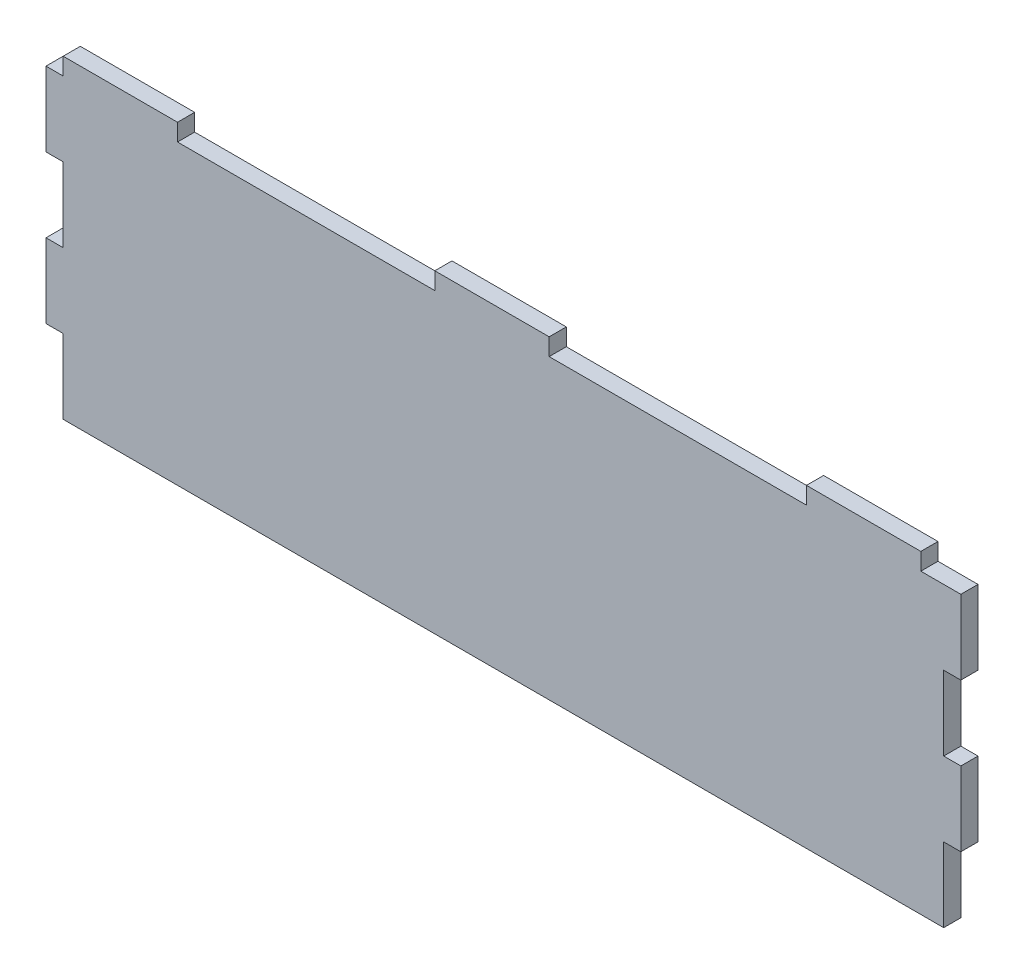
ISO-10303-21;
HEADER;
FILE_DESCRIPTION(('STEP AP214'),'2;1');
FILE_NAME('part.step','',(''),(''),'','','');
FILE_SCHEMA(('AUTOMOTIVE_DESIGN { 1 0 10303 214 1 1 1 1 }'));
ENDSEC;
DATA;
#1=APPLICATION_CONTEXT('core data for automotive mechanical design processes');
#2=APPLICATION_PROTOCOL_DEFINITION('international standard','automotive_design',2000,#1);
#3=PRODUCT_CONTEXT('',#1,'mechanical');
#4=PRODUCT('Part','Part','',(#3));
#5=PRODUCT_RELATED_PRODUCT_CATEGORY('part','',(#4));
#6=PRODUCT_DEFINITION_FORMATION('','',#4);
#7=PRODUCT_DEFINITION_CONTEXT('part definition',#1,'design');
#8=PRODUCT_DEFINITION('design','',#6,#7);
#9=PRODUCT_DEFINITION_SHAPE('','',#8);
#10=(LENGTH_UNIT() NAMED_UNIT(*) SI_UNIT(.MILLI.,.METRE.));
#11=(NAMED_UNIT(*) PLANE_ANGLE_UNIT() SI_UNIT($,.RADIAN.));
#12=(NAMED_UNIT(*) SI_UNIT($,.STERADIAN.) SOLID_ANGLE_UNIT());
#13=UNCERTAINTY_MEASURE_WITH_UNIT(LENGTH_MEASURE(1.E-05),#10,'distance_accuracy_value','');
#14=(GEOMETRIC_REPRESENTATION_CONTEXT(3) GLOBAL_UNCERTAINTY_ASSIGNED_CONTEXT((#13)) GLOBAL_UNIT_ASSIGNED_CONTEXT((#10,
#11,#12)) REPRESENTATION_CONTEXT('',''));
#15=CARTESIAN_POINT('',(0.,0.,0.));
#16=DIRECTION('',(0.,0.,1.));
#17=DIRECTION('',(1.,0.,0.));
#18=AXIS2_PLACEMENT_3D('',#15,#16,#17);
#19=CARTESIAN_POINT('',(0.,24.5,3.));
#20=DIRECTION('',(0.,1.,0.));
#21=DIRECTION('',(0.,0.,1.));
#22=AXIS2_PLACEMENT_3D('',#19,#20,#21);
#23=PLANE('',#22);
#24=DIRECTION('',(1.,0.,0.));
#25=VECTOR('',#24,1.);
#26=CARTESIAN_POINT('',(0.,24.5,0.));
#27=LINE('',#26,#25);
#28=CARTESIAN_POINT('',(-57.,24.5,0.));
#29=VERTEX_POINT('',#28);
#30=CARTESIAN_POINT('',(-12.,24.5,0.));
#31=VERTEX_POINT('',#30);
#32=EDGE_CURVE('E247',#29,#31,#27,.T.);
#33=ORIENTED_EDGE('',*,*,#32,.F.);
#34=DIRECTION('',(0.,0.,-1.));
#35=VECTOR('',#34,1.);
#36=CARTESIAN_POINT('',(-57.,24.5,3.));
#37=LINE('',#36,#35);
#38=CARTESIAN_POINT('',(-57.,24.5,3.));
#39=VERTEX_POINT('',#38);
#40=EDGE_CURVE('E11',#39,#29,#37,.T.);
#41=ORIENTED_EDGE('',*,*,#40,.F.);
#42=DIRECTION('',(1.,0.,0.));
#43=VECTOR('',#42,1.);
#44=CARTESIAN_POINT('',(0.,24.5,3.));
#45=LINE('',#44,#43);
#46=CARTESIAN_POINT('',(-12.,24.5,3.));
#47=VERTEX_POINT('',#46);
#48=EDGE_CURVE('E322',#39,#47,#45,.T.);
#49=ORIENTED_EDGE('',*,*,#48,.T.);
#50=DIRECTION('',(0.,0.,-1.));
#51=VECTOR('',#50,1.);
#52=CARTESIAN_POINT('',(-12.,24.5,3.));
#53=LINE('',#52,#51);
#54=EDGE_CURVE('E145',#47,#31,#53,.T.);
#55=ORIENTED_EDGE('',*,*,#54,.T.);
#56=EDGE_LOOP('',(#33,#41,#49,#55));
#57=FACE_BOUND('',#56,.T.);
#58=ADVANCED_FACE('F35',(#57),#23,.T.);
#59=CARTESIAN_POINT('',(-57.,0.,3.));
#60=DIRECTION('',(1.,0.,0.));
#61=DIRECTION('',(0.,0.,-1.));
#62=AXIS2_PLACEMENT_3D('',#59,#60,#61);
#63=PLANE('',#62);
#64=DIRECTION('',(0.,-1.,0.));
#65=VECTOR('',#64,1.);
#66=CARTESIAN_POINT('',(-57.,0.,0.));
#67=LINE('',#66,#65);
#68=CARTESIAN_POINT('',(-57.,27.5,0.));
#69=VERTEX_POINT('',#68);
#70=EDGE_CURVE('E250',#69,#29,#67,.T.);
#71=ORIENTED_EDGE('',*,*,#70,.F.);
#72=DIRECTION('',(0.,0.,-1.));
#73=VECTOR('',#72,1.);
#74=CARTESIAN_POINT('',(-57.,27.5,3.));
#75=LINE('',#74,#73);
#76=CARTESIAN_POINT('',(-57.,27.5,3.));
#77=VERTEX_POINT('',#76);
#78=EDGE_CURVE('E43',#77,#69,#75,.T.);
#79=ORIENTED_EDGE('',*,*,#78,.F.);
#80=DIRECTION('',(0.,-1.,0.));
#81=VECTOR('',#80,1.);
#82=CARTESIAN_POINT('',(-57.,0.,3.));
#83=LINE('',#82,#81);
#84=EDGE_CURVE('E399',#77,#39,#83,.T.);
#85=ORIENTED_EDGE('',*,*,#84,.T.);
#86=ORIENTED_EDGE('',*,*,#40,.T.);
#87=EDGE_LOOP('',(#71,#79,#85,#86));
#88=FACE_BOUND('',#87,.T.);
#89=ADVANCED_FACE('F384',(#88),#63,.T.);
#90=CARTESIAN_POINT('',(0.,27.5,3.));
#91=DIRECTION('',(0.,1.,0.));
#92=DIRECTION('',(0.,0.,1.));
#93=AXIS2_PLACEMENT_3D('',#90,#91,#92);
#94=PLANE('',#93);
#95=DIRECTION('',(1.,0.,0.));
#96=VECTOR('',#95,1.);
#97=CARTESIAN_POINT('',(0.,27.5,0.));
#98=LINE('',#97,#96);
#99=CARTESIAN_POINT('',(-77.,27.5,0.));
#100=VERTEX_POINT('',#99);
#101=EDGE_CURVE('E253',#100,#69,#98,.T.);
#102=ORIENTED_EDGE('',*,*,#101,.F.);
#103=DIRECTION('',(0.,0.,-1.));
#104=VECTOR('',#103,1.);
#105=CARTESIAN_POINT('',(-77.,27.5,3.));
#106=LINE('',#105,#104);
#107=CARTESIAN_POINT('',(-77.,27.5,3.));
#108=VERTEX_POINT('',#107);
#109=EDGE_CURVE('E373',#108,#100,#106,.T.);
#110=ORIENTED_EDGE('',*,*,#109,.F.);
#111=DIRECTION('',(1.,0.,0.));
#112=VECTOR('',#111,1.);
#113=CARTESIAN_POINT('',(0.,27.5,3.));
#114=LINE('',#113,#112);
#115=EDGE_CURVE('E380',#108,#77,#114,.T.);
#116=ORIENTED_EDGE('',*,*,#115,.T.);
#117=ORIENTED_EDGE('',*,*,#78,.T.);
#118=EDGE_LOOP('',(#102,#110,#116,#117));
#119=FACE_BOUND('',#118,.T.);
#120=ADVANCED_FACE('F378',(#119),#94,.T.);
#121=CARTESIAN_POINT('',(-77.,0.,3.));
#122=DIRECTION('',(1.,0.,0.));
#123=DIRECTION('',(0.,0.,-1.));
#124=AXIS2_PLACEMENT_3D('',#121,#122,#123);
#125=PLANE('',#124);
#126=DIRECTION('',(0.,-1.,0.));
#127=VECTOR('',#126,1.);
#128=CARTESIAN_POINT('',(-77.,0.,0.));
#129=LINE('',#128,#127);
#130=CARTESIAN_POINT('',(-77.,24.5,0.));
#131=VERTEX_POINT('',#130);
#132=EDGE_CURVE('E256',#100,#131,#129,.T.);
#133=ORIENTED_EDGE('',*,*,#132,.T.);
#134=DIRECTION('',(0.,0.,-1.));
#135=VECTOR('',#134,1.);
#136=CARTESIAN_POINT('',(-77.,24.5,3.));
#137=LINE('',#136,#135);
#138=CARTESIAN_POINT('',(-77.,24.5,3.));
#139=VERTEX_POINT('',#138);
#140=EDGE_CURVE('E371',#139,#131,#137,.T.);
#141=ORIENTED_EDGE('',*,*,#140,.F.);
#142=DIRECTION('',(0.,-1.,0.));
#143=VECTOR('',#142,1.);
#144=CARTESIAN_POINT('',(-77.,0.,3.));
#145=LINE('',#144,#143);
#146=EDGE_CURVE('E395',#108,#139,#145,.T.);
#147=ORIENTED_EDGE('',*,*,#146,.F.);
#148=ORIENTED_EDGE('',*,*,#109,.T.);
#149=EDGE_LOOP('',(#133,#141,#147,#148));
#150=FACE_BOUND('',#149,.T.);
#151=ADVANCED_FACE('F392',(#150),#125,.F.);
#152=CARTESIAN_POINT('',(0.,24.5,3.));
#153=DIRECTION('',(0.,1.,0.));
#154=DIRECTION('',(0.,0.,1.));
#155=AXIS2_PLACEMENT_3D('',#152,#153,#154);
#156=PLANE('',#155);
#157=DIRECTION('',(1.,0.,0.));
#158=VECTOR('',#157,1.);
#159=CARTESIAN_POINT('',(0.,24.5,0.));
#160=LINE('',#159,#158);
#161=CARTESIAN_POINT('',(-80.,24.5,0.));
#162=VERTEX_POINT('',#161);
#163=EDGE_CURVE('E259',#162,#131,#160,.T.);
#164=ORIENTED_EDGE('',*,*,#163,.F.);
#165=DIRECTION('',(0.,0.,-1.));
#166=VECTOR('',#165,1.);
#167=CARTESIAN_POINT('',(-80.,24.5,3.));
#168=LINE('',#167,#166);
#169=CARTESIAN_POINT('',(-80.,24.5,3.));
#170=VERTEX_POINT('',#169);
#171=EDGE_CURVE('E369',#170,#162,#168,.T.);
#172=ORIENTED_EDGE('',*,*,#171,.F.);
#173=DIRECTION('',(1.,0.,0.));
#174=VECTOR('',#173,1.);
#175=CARTESIAN_POINT('',(0.,24.5,3.));
#176=LINE('',#175,#174);
#177=EDGE_CURVE('E397',#170,#139,#176,.T.);
#178=ORIENTED_EDGE('',*,*,#177,.T.);
#179=ORIENTED_EDGE('',*,*,#140,.T.);
#180=EDGE_LOOP('',(#164,#172,#178,#179));
#181=FACE_BOUND('',#180,.T.);
#182=ADVANCED_FACE('F468',(#181),#156,.T.);
#183=CARTESIAN_POINT('',(-80.,0.,3.));
#184=DIRECTION('',(1.,0.,0.));
#185=DIRECTION('',(0.,0.,-1.));
#186=AXIS2_PLACEMENT_3D('',#183,#184,#185);
#187=PLANE('',#186);
#188=DIRECTION('',(0.,-1.,0.));
#189=VECTOR('',#188,1.);
#190=CARTESIAN_POINT('',(-80.,0.,0.));
#191=LINE('',#190,#189);
#192=CARTESIAN_POINT('',(-80.,11.5,0.));
#193=VERTEX_POINT('',#192);
#194=EDGE_CURVE('E262',#162,#193,#191,.T.);
#195=ORIENTED_EDGE('',*,*,#194,.T.);
#196=DIRECTION('',(0.,0.,-1.));
#197=VECTOR('',#196,1.);
#198=CARTESIAN_POINT('',(-80.,11.5,3.));
#199=LINE('',#198,#197);
#200=CARTESIAN_POINT('',(-80.,11.5,3.));
#201=VERTEX_POINT('',#200);
#202=EDGE_CURVE('E366',#201,#193,#199,.T.);
#203=ORIENTED_EDGE('',*,*,#202,.F.);
#204=DIRECTION('',(0.,-1.,0.));
#205=VECTOR('',#204,1.);
#206=CARTESIAN_POINT('',(-80.,0.,3.));
#207=LINE('',#206,#205);
#208=EDGE_CURVE('E405',#170,#201,#207,.T.);
#209=ORIENTED_EDGE('',*,*,#208,.F.);
#210=ORIENTED_EDGE('',*,*,#171,.T.);
#211=EDGE_LOOP('',(#195,#203,#209,#210));
#212=FACE_BOUND('',#211,.T.);
#213=ADVANCED_FACE('F471',(#212),#187,.F.);
#214=CARTESIAN_POINT('',(0.,11.5,3.));
#215=DIRECTION('',(0.,1.,0.));
#216=DIRECTION('',(0.,0.,1.));
#217=AXIS2_PLACEMENT_3D('',#214,#215,#216);
#218=PLANE('',#217);
#219=DIRECTION('',(1.,0.,0.));
#220=VECTOR('',#219,1.);
#221=CARTESIAN_POINT('',(0.,11.5,0.));
#222=LINE('',#221,#220);
#223=CARTESIAN_POINT('',(-77.,11.5,0.));
#224=VERTEX_POINT('',#223);
#225=EDGE_CURVE('E264',#193,#224,#222,.T.);
#226=ORIENTED_EDGE('',*,*,#225,.T.);
#227=DIRECTION('',(0.,0.,-1.));
#228=VECTOR('',#227,1.);
#229=CARTESIAN_POINT('',(-77.,11.5,3.));
#230=LINE('',#229,#228);
#231=CARTESIAN_POINT('',(-77.,11.5,3.));
#232=VERTEX_POINT('',#231);
#233=EDGE_CURVE('E363',#232,#224,#230,.T.);
#234=ORIENTED_EDGE('',*,*,#233,.F.);
#235=DIRECTION('',(1.,0.,0.));
#236=VECTOR('',#235,1.);
#237=CARTESIAN_POINT('',(0.,11.5,3.));
#238=LINE('',#237,#236);
#239=EDGE_CURVE('E407',#201,#232,#238,.T.);
#240=ORIENTED_EDGE('',*,*,#239,.F.);
#241=ORIENTED_EDGE('',*,*,#202,.T.);
#242=EDGE_LOOP('',(#226,#234,#240,#241));
#243=FACE_BOUND('',#242,.T.);
#244=ADVANCED_FACE('F475',(#243),#218,.F.);
#245=CARTESIAN_POINT('',(-77.,0.,3.));
#246=DIRECTION('',(1.,0.,0.));
#247=DIRECTION('',(0.,0.,-1.));
#248=AXIS2_PLACEMENT_3D('',#245,#246,#247);
#249=PLANE('',#248);
#250=DIRECTION('',(0.,-1.,0.));
#251=VECTOR('',#250,1.);
#252=CARTESIAN_POINT('',(-77.,0.,0.));
#253=LINE('',#252,#251);
#254=CARTESIAN_POINT('',(-77.,-1.5,0.));
#255=VERTEX_POINT('',#254);
#256=EDGE_CURVE('E266',#224,#255,#253,.T.);
#257=ORIENTED_EDGE('',*,*,#256,.T.);
#258=DIRECTION('',(0.,0.,-1.));
#259=VECTOR('',#258,1.);
#260=CARTESIAN_POINT('',(-77.,-1.5,3.));
#261=LINE('',#260,#259);
#262=CARTESIAN_POINT('',(-77.,-1.5,3.));
#263=VERTEX_POINT('',#262);
#264=EDGE_CURVE('E361',#263,#255,#261,.T.);
#265=ORIENTED_EDGE('',*,*,#264,.F.);
#266=DIRECTION('',(0.,-1.,0.));
#267=VECTOR('',#266,1.);
#268=CARTESIAN_POINT('',(-77.,0.,3.));
#269=LINE('',#268,#267);
#270=EDGE_CURVE('E409',#232,#263,#269,.T.);
#271=ORIENTED_EDGE('',*,*,#270,.F.);
#272=ORIENTED_EDGE('',*,*,#233,.T.);
#273=EDGE_LOOP('',(#257,#265,#271,#272));
#274=FACE_BOUND('',#273,.T.);
#275=ADVANCED_FACE('F479',(#274),#249,.F.);
#276=CARTESIAN_POINT('',(0.,-1.5,3.));
#277=DIRECTION('',(0.,1.,0.));
#278=DIRECTION('',(0.,0.,1.));
#279=AXIS2_PLACEMENT_3D('',#276,#277,#278);
#280=PLANE('',#279);
#281=DIRECTION('',(1.,0.,0.));
#282=VECTOR('',#281,1.);
#283=CARTESIAN_POINT('',(0.,-1.5,0.));
#284=LINE('',#283,#282);
#285=CARTESIAN_POINT('',(-80.,-1.5,0.));
#286=VERTEX_POINT('',#285);
#287=EDGE_CURVE('E269',#286,#255,#284,.T.);
#288=ORIENTED_EDGE('',*,*,#287,.F.);
#289=DIRECTION('',(0.,0.,-1.));
#290=VECTOR('',#289,1.);
#291=CARTESIAN_POINT('',(-80.,-1.5,3.));
#292=LINE('',#291,#290);
#293=CARTESIAN_POINT('',(-80.,-1.5,3.));
#294=VERTEX_POINT('',#293);
#295=EDGE_CURVE('E359',#294,#286,#292,.T.);
#296=ORIENTED_EDGE('',*,*,#295,.F.);
#297=DIRECTION('',(1.,0.,0.));
#298=VECTOR('',#297,1.);
#299=CARTESIAN_POINT('',(0.,-1.5,3.));
#300=LINE('',#299,#298);
#301=EDGE_CURVE('E411',#294,#263,#300,.T.);
#302=ORIENTED_EDGE('',*,*,#301,.T.);
#303=ORIENTED_EDGE('',*,*,#264,.T.);
#304=EDGE_LOOP('',(#288,#296,#302,#303));
#305=FACE_BOUND('',#304,.T.);
#306=ADVANCED_FACE('F483',(#305),#280,.T.);
#307=CARTESIAN_POINT('',(-80.,0.,3.));
#308=DIRECTION('',(1.,0.,0.));
#309=DIRECTION('',(0.,0.,-1.));
#310=AXIS2_PLACEMENT_3D('',#307,#308,#309);
#311=PLANE('',#310);
#312=DIRECTION('',(0.,-1.,0.));
#313=VECTOR('',#312,1.);
#314=CARTESIAN_POINT('',(-80.,0.,0.));
#315=LINE('',#314,#313);
#316=CARTESIAN_POINT('',(-80.,-14.5,0.));
#317=VERTEX_POINT('',#316);
#318=EDGE_CURVE('E272',#286,#317,#315,.T.);
#319=ORIENTED_EDGE('',*,*,#318,.T.);
#320=DIRECTION('',(0.,0.,-1.));
#321=VECTOR('',#320,1.);
#322=CARTESIAN_POINT('',(-80.,-14.5,3.));
#323=LINE('',#322,#321);
#324=CARTESIAN_POINT('',(-80.,-14.5,3.));
#325=VERTEX_POINT('',#324);
#326=EDGE_CURVE('E356',#325,#317,#323,.T.);
#327=ORIENTED_EDGE('',*,*,#326,.F.);
#328=DIRECTION('',(0.,-1.,0.));
#329=VECTOR('',#328,1.);
#330=CARTESIAN_POINT('',(-80.,0.,3.));
#331=LINE('',#330,#329);
#332=EDGE_CURVE('E414',#294,#325,#331,.T.);
#333=ORIENTED_EDGE('',*,*,#332,.F.);
#334=ORIENTED_EDGE('',*,*,#295,.T.);
#335=EDGE_LOOP('',(#319,#327,#333,#334));
#336=FACE_BOUND('',#335,.T.);
#337=ADVANCED_FACE('F487',(#336),#311,.F.);
#338=CARTESIAN_POINT('',(0.,-14.5,3.));
#339=DIRECTION('',(0.,1.,0.));
#340=DIRECTION('',(0.,0.,1.));
#341=AXIS2_PLACEMENT_3D('',#338,#339,#340);
#342=PLANE('',#341);
#343=DIRECTION('',(1.,0.,0.));
#344=VECTOR('',#343,1.);
#345=CARTESIAN_POINT('',(0.,-14.5,0.));
#346=LINE('',#345,#344);
#347=CARTESIAN_POINT('',(-77.,-14.5,0.));
#348=VERTEX_POINT('',#347);
#349=EDGE_CURVE('E274',#317,#348,#346,.T.);
#350=ORIENTED_EDGE('',*,*,#349,.T.);
#351=DIRECTION('',(0.,0.,-1.));
#352=VECTOR('',#351,1.);
#353=CARTESIAN_POINT('',(-77.,-14.5,3.));
#354=LINE('',#353,#352);
#355=CARTESIAN_POINT('',(-77.,-14.5,3.));
#356=VERTEX_POINT('',#355);
#357=EDGE_CURVE('E353',#356,#348,#354,.T.);
#358=ORIENTED_EDGE('',*,*,#357,.F.);
#359=DIRECTION('',(1.,0.,0.));
#360=VECTOR('',#359,1.);
#361=CARTESIAN_POINT('',(0.,-14.5,3.));
#362=LINE('',#361,#360);
#363=EDGE_CURVE('E416',#325,#356,#362,.T.);
#364=ORIENTED_EDGE('',*,*,#363,.F.);
#365=ORIENTED_EDGE('',*,*,#326,.T.);
#366=EDGE_LOOP('',(#350,#358,#364,#365));
#367=FACE_BOUND('',#366,.T.);
#368=ADVANCED_FACE('F491',(#367),#342,.F.);
#369=CARTESIAN_POINT('',(-77.,0.,3.));
#370=DIRECTION('',(1.,0.,0.));
#371=DIRECTION('',(0.,0.,-1.));
#372=AXIS2_PLACEMENT_3D('',#369,#370,#371);
#373=PLANE('',#372);
#374=DIRECTION('',(0.,-1.,0.));
#375=VECTOR('',#374,1.);
#376=CARTESIAN_POINT('',(-77.,0.,0.));
#377=LINE('',#376,#375);
#378=CARTESIAN_POINT('',(-77.,-27.5,0.));
#379=VERTEX_POINT('',#378);
#380=EDGE_CURVE('E276',#348,#379,#377,.T.);
#381=ORIENTED_EDGE('',*,*,#380,.T.);
#382=DIRECTION('',(0.,0.,-1.));
#383=VECTOR('',#382,1.);
#384=CARTESIAN_POINT('',(-77.,-27.5,3.));
#385=LINE('',#384,#383);
#386=CARTESIAN_POINT('',(-77.,-27.5,3.));
#387=VERTEX_POINT('',#386);
#388=EDGE_CURVE('E350',#387,#379,#385,.T.);
#389=ORIENTED_EDGE('',*,*,#388,.F.);
#390=DIRECTION('',(0.,-1.,0.));
#391=VECTOR('',#390,1.);
#392=CARTESIAN_POINT('',(-77.,0.,3.));
#393=LINE('',#392,#391);
#394=EDGE_CURVE('E418',#356,#387,#393,.T.);
#395=ORIENTED_EDGE('',*,*,#394,.F.);
#396=ORIENTED_EDGE('',*,*,#357,.T.);
#397=EDGE_LOOP('',(#381,#389,#395,#396));
#398=FACE_BOUND('',#397,.T.);
#399=ADVANCED_FACE('F495',(#398),#373,.F.);
#400=CARTESIAN_POINT('',(0.,-27.5,3.));
#401=DIRECTION('',(0.,1.,0.));
#402=DIRECTION('',(0.,0.,1.));
#403=AXIS2_PLACEMENT_3D('',#400,#401,#402);
#404=PLANE('',#403);
#405=DIRECTION('',(1.,0.,0.));
#406=VECTOR('',#405,1.);
#407=CARTESIAN_POINT('',(0.,-27.5,0.));
#408=LINE('',#407,#406);
#409=CARTESIAN_POINT('',(77.,-27.5,0.));
#410=VERTEX_POINT('',#409);
#411=EDGE_CURVE('E278',#379,#410,#408,.T.);
#412=ORIENTED_EDGE('',*,*,#411,.T.);
#413=DIRECTION('',(0.,0.,-1.));
#414=VECTOR('',#413,1.);
#415=CARTESIAN_POINT('',(77.,-27.5,3.));
#416=LINE('',#415,#414);
#417=CARTESIAN_POINT('',(77.,-27.5,3.));
#418=VERTEX_POINT('',#417);
#419=EDGE_CURVE('E348',#418,#410,#416,.T.);
#420=ORIENTED_EDGE('',*,*,#419,.F.);
#421=DIRECTION('',(1.,0.,0.));
#422=VECTOR('',#421,1.);
#423=CARTESIAN_POINT('',(0.,-27.5,3.));
#424=LINE('',#423,#422);
#425=EDGE_CURVE('E420',#387,#418,#424,.T.);
#426=ORIENTED_EDGE('',*,*,#425,.F.);
#427=ORIENTED_EDGE('',*,*,#388,.T.);
#428=EDGE_LOOP('',(#412,#420,#426,#427));
#429=FACE_BOUND('',#428,.T.);
#430=ADVANCED_FACE('F499',(#429),#404,.F.);
#431=CARTESIAN_POINT('',(77.,0.,3.));
#432=DIRECTION('',(1.,0.,0.));
#433=DIRECTION('',(0.,1.,0.));
#434=AXIS2_PLACEMENT_3D('',#431,#432,#433);
#435=PLANE('',#434);
#436=DIRECTION('',(0.,-1.,0.));
#437=VECTOR('',#436,1.);
#438=CARTESIAN_POINT('',(77.,0.,0.));
#439=LINE('',#438,#437);
#440=CARTESIAN_POINT('',(77.,-14.5,0.));
#441=VERTEX_POINT('',#440);
#442=EDGE_CURVE('E281',#441,#410,#439,.T.);
#443=ORIENTED_EDGE('',*,*,#442,.F.);
#444=DIRECTION('',(0.,0.,-1.));
#445=VECTOR('',#444,1.);
#446=CARTESIAN_POINT('',(77.,-14.5,3.));
#447=LINE('',#446,#445);
#448=CARTESIAN_POINT('',(77.,-14.5,3.));
#449=VERTEX_POINT('',#448);
#450=EDGE_CURVE('E346',#449,#441,#447,.T.);
#451=ORIENTED_EDGE('',*,*,#450,.F.);
#452=DIRECTION('',(0.,-1.,0.));
#453=VECTOR('',#452,1.);
#454=CARTESIAN_POINT('',(77.,0.,3.));
#455=LINE('',#454,#453);
#456=EDGE_CURVE('E422',#449,#418,#455,.T.);
#457=ORIENTED_EDGE('',*,*,#456,.T.);
#458=ORIENTED_EDGE('',*,*,#419,.T.);
#459=EDGE_LOOP('',(#443,#451,#457,#458));
#460=FACE_BOUND('',#459,.T.);
#461=ADVANCED_FACE('F503',(#460),#435,.T.);
#462=CARTESIAN_POINT('',(0.,-14.5,3.));
#463=DIRECTION('',(0.,-1.,0.));
#464=DIRECTION('',(0.,0.,-1.));
#465=AXIS2_PLACEMENT_3D('',#462,#463,#464);
#466=PLANE('',#465);
#467=DIRECTION('',(-1.,0.,0.));
#468=VECTOR('',#467,1.);
#469=CARTESIAN_POINT('',(0.,-14.5,0.));
#470=LINE('',#469,#468);
#471=CARTESIAN_POINT('',(80.,-14.5,0.));
#472=VERTEX_POINT('',#471);
#473=EDGE_CURVE('E284',#472,#441,#470,.T.);
#474=ORIENTED_EDGE('',*,*,#473,.F.);
#475=DIRECTION('',(0.,0.,-1.));
#476=VECTOR('',#475,1.);
#477=CARTESIAN_POINT('',(80.,-14.5,3.));
#478=LINE('',#477,#476);
#479=CARTESIAN_POINT('',(80.,-14.5,3.));
#480=VERTEX_POINT('',#479);
#481=EDGE_CURVE('E344',#480,#472,#478,.T.);
#482=ORIENTED_EDGE('',*,*,#481,.F.);
#483=DIRECTION('',(-1.,0.,0.));
#484=VECTOR('',#483,1.);
#485=CARTESIAN_POINT('',(0.,-14.5,3.));
#486=LINE('',#485,#484);
#487=EDGE_CURVE('E425',#480,#449,#486,.T.);
#488=ORIENTED_EDGE('',*,*,#487,.T.);
#489=ORIENTED_EDGE('',*,*,#450,.T.);
#490=EDGE_LOOP('',(#474,#482,#488,#489));
#491=FACE_BOUND('',#490,.T.);
#492=ADVANCED_FACE('F507',(#491),#466,.T.);
#493=CARTESIAN_POINT('',(80.,-1.70803542250024E-13,3.));
#494=DIRECTION('',(1.,0.,0.));
#495=DIRECTION('',(0.,1.,0.));
#496=AXIS2_PLACEMENT_3D('',#493,#494,#495);
#497=PLANE('',#496);
#498=DIRECTION('',(0.,-1.,0.));
#499=VECTOR('',#498,1.);
#500=CARTESIAN_POINT('',(80.,-1.70803542250024E-13,0.));
#501=LINE('',#500,#499);
#502=CARTESIAN_POINT('',(80.,-1.5,0.));
#503=VERTEX_POINT('',#502);
#504=EDGE_CURVE('E287',#503,#472,#501,.T.);
#505=ORIENTED_EDGE('',*,*,#504,.F.);
#506=DIRECTION('',(0.,0.,-1.));
#507=VECTOR('',#506,1.);
#508=CARTESIAN_POINT('',(80.,-1.5,3.));
#509=LINE('',#508,#507);
#510=CARTESIAN_POINT('',(80.,-1.5,3.));
#511=VERTEX_POINT('',#510);
#512=EDGE_CURVE('E342',#511,#503,#509,.T.);
#513=ORIENTED_EDGE('',*,*,#512,.F.);
#514=DIRECTION('',(0.,-1.,0.));
#515=VECTOR('',#514,1.);
#516=CARTESIAN_POINT('',(80.,-1.70803542250024E-13,3.));
#517=LINE('',#516,#515);
#518=EDGE_CURVE('E428',#511,#480,#517,.T.);
#519=ORIENTED_EDGE('',*,*,#518,.T.);
#520=ORIENTED_EDGE('',*,*,#481,.T.);
#521=EDGE_LOOP('',(#505,#513,#519,#520));
#522=FACE_BOUND('',#521,.T.);
#523=ADVANCED_FACE('F511',(#522),#497,.T.);
#524=CARTESIAN_POINT('',(0.,-1.5,3.));
#525=DIRECTION('',(0.,-1.,0.));
#526=DIRECTION('',(0.,0.,-1.));
#527=AXIS2_PLACEMENT_3D('',#524,#525,#526);
#528=PLANE('',#527);
#529=DIRECTION('',(-1.,0.,0.));
#530=VECTOR('',#529,1.);
#531=CARTESIAN_POINT('',(0.,-1.5,0.));
#532=LINE('',#531,#530);
#533=CARTESIAN_POINT('',(77.,-1.5,0.));
#534=VERTEX_POINT('',#533);
#535=EDGE_CURVE('E290',#503,#534,#532,.T.);
#536=ORIENTED_EDGE('',*,*,#535,.T.);
#537=DIRECTION('',(0.,0.,-1.));
#538=VECTOR('',#537,1.);
#539=CARTESIAN_POINT('',(77.,-1.5,3.));
#540=LINE('',#539,#538);
#541=CARTESIAN_POINT('',(77.,-1.5,3.));
#542=VERTEX_POINT('',#541);
#543=EDGE_CURVE('E340',#542,#534,#540,.T.);
#544=ORIENTED_EDGE('',*,*,#543,.F.);
#545=DIRECTION('',(-1.,0.,0.));
#546=VECTOR('',#545,1.);
#547=CARTESIAN_POINT('',(0.,-1.5,3.));
#548=LINE('',#547,#546);
#549=EDGE_CURVE('E431',#511,#542,#548,.T.);
#550=ORIENTED_EDGE('',*,*,#549,.F.);
#551=ORIENTED_EDGE('',*,*,#512,.T.);
#552=EDGE_LOOP('',(#536,#544,#550,#551));
#553=FACE_BOUND('',#552,.T.);
#554=ADVANCED_FACE('F515',(#553),#528,.F.);
#555=CARTESIAN_POINT('',(77.,1.64398409415648E-13,3.));
#556=DIRECTION('',(1.,0.,0.));
#557=DIRECTION('',(0.,1.,0.));
#558=AXIS2_PLACEMENT_3D('',#555,#556,#557);
#559=PLANE('',#558);
#560=DIRECTION('',(0.,-1.,0.));
#561=VECTOR('',#560,1.);
#562=CARTESIAN_POINT('',(77.,1.64398409415648E-13,0.));
#563=LINE('',#562,#561);
#564=CARTESIAN_POINT('',(77.,11.5,0.));
#565=VERTEX_POINT('',#564);
#566=EDGE_CURVE('E293',#565,#534,#563,.T.);
#567=ORIENTED_EDGE('',*,*,#566,.F.);
#568=DIRECTION('',(0.,0.,-1.));
#569=VECTOR('',#568,1.);
#570=CARTESIAN_POINT('',(77.,11.5,3.));
#571=LINE('',#570,#569);
#572=CARTESIAN_POINT('',(77.,11.5,3.));
#573=VERTEX_POINT('',#572);
#574=EDGE_CURVE('E338',#573,#565,#571,.T.);
#575=ORIENTED_EDGE('',*,*,#574,.F.);
#576=DIRECTION('',(0.,-1.,0.));
#577=VECTOR('',#576,1.);
#578=CARTESIAN_POINT('',(77.,1.64398409415648E-13,3.));
#579=LINE('',#578,#577);
#580=EDGE_CURVE('E433',#573,#542,#579,.T.);
#581=ORIENTED_EDGE('',*,*,#580,.T.);
#582=ORIENTED_EDGE('',*,*,#543,.T.);
#583=EDGE_LOOP('',(#567,#575,#581,#582));
#584=FACE_BOUND('',#583,.T.);
#585=ADVANCED_FACE('F519',(#584),#559,.T.);
#586=CARTESIAN_POINT('',(0.,11.5,3.));
#587=DIRECTION('',(0.,1.,0.));
#588=DIRECTION('',(0.,0.,1.));
#589=AXIS2_PLACEMENT_3D('',#586,#587,#588);
#590=PLANE('',#589);
#591=DIRECTION('',(1.,0.,0.));
#592=VECTOR('',#591,1.);
#593=CARTESIAN_POINT('',(0.,11.5,0.));
#594=LINE('',#593,#592);
#595=CARTESIAN_POINT('',(80.,11.5,0.));
#596=VERTEX_POINT('',#595);
#597=EDGE_CURVE('E296',#565,#596,#594,.T.);
#598=ORIENTED_EDGE('',*,*,#597,.T.);
#599=DIRECTION('',(0.,0.,-1.));
#600=VECTOR('',#599,1.);
#601=CARTESIAN_POINT('',(80.,11.5,3.));
#602=LINE('',#601,#600);
#603=CARTESIAN_POINT('',(80.,11.5,3.));
#604=VERTEX_POINT('',#603);
#605=EDGE_CURVE('E336',#604,#596,#602,.T.);
#606=ORIENTED_EDGE('',*,*,#605,.F.);
#607=DIRECTION('',(1.,0.,0.));
#608=VECTOR('',#607,1.);
#609=CARTESIAN_POINT('',(0.,11.5,3.));
#610=LINE('',#609,#608);
#611=EDGE_CURVE('E436',#573,#604,#610,.T.);
#612=ORIENTED_EDGE('',*,*,#611,.F.);
#613=ORIENTED_EDGE('',*,*,#574,.T.);
#614=EDGE_LOOP('',(#598,#606,#612,#613));
#615=FACE_BOUND('',#614,.T.);
#616=ADVANCED_FACE('F523',(#615),#590,.F.);
#617=CARTESIAN_POINT('',(80.,0.,3.));
#618=DIRECTION('',(1.,0.,0.));
#619=DIRECTION('',(0.,0.,-1.));
#620=AXIS2_PLACEMENT_3D('',#617,#618,#619);
#621=PLANE('',#620);
#622=DIRECTION('',(0.,-1.,0.));
#623=VECTOR('',#622,1.);
#624=CARTESIAN_POINT('',(80.,0.,0.));
#625=LINE('',#624,#623);
#626=CARTESIAN_POINT('',(80.,24.5,0.));
#627=VERTEX_POINT('',#626);
#628=EDGE_CURVE('E299',#627,#596,#625,.T.);
#629=ORIENTED_EDGE('',*,*,#628,.F.);
#630=DIRECTION('',(0.,0.,-1.));
#631=VECTOR('',#630,1.);
#632=CARTESIAN_POINT('',(80.,24.5,3.));
#633=LINE('',#632,#631);
#634=CARTESIAN_POINT('',(80.,24.5,3.));
#635=VERTEX_POINT('',#634);
#636=EDGE_CURVE('E334',#635,#627,#633,.T.);
#637=ORIENTED_EDGE('',*,*,#636,.F.);
#638=DIRECTION('',(0.,-1.,0.));
#639=VECTOR('',#638,1.);
#640=CARTESIAN_POINT('',(80.,0.,3.));
#641=LINE('',#640,#639);
#642=EDGE_CURVE('E438',#635,#604,#641,.T.);
#643=ORIENTED_EDGE('',*,*,#642,.T.);
#644=ORIENTED_EDGE('',*,*,#605,.T.);
#645=EDGE_LOOP('',(#629,#637,#643,#644));
#646=FACE_BOUND('',#645,.T.);
#647=ADVANCED_FACE('F527',(#646),#621,.T.);
#648=CARTESIAN_POINT('',(0.,24.5,3.));
#649=DIRECTION('',(0.,1.,0.));
#650=DIRECTION('',(0.,0.,1.));
#651=AXIS2_PLACEMENT_3D('',#648,#649,#650);
#652=PLANE('',#651);
#653=DIRECTION('',(1.,0.,0.));
#654=VECTOR('',#653,1.);
#655=CARTESIAN_POINT('',(0.,24.5,0.));
#656=LINE('',#655,#654);
#657=CARTESIAN_POINT('',(73.,24.5,0.));
#658=VERTEX_POINT('',#657);
#659=EDGE_CURVE('E302',#658,#627,#656,.T.);
#660=ORIENTED_EDGE('',*,*,#659,.F.);
#661=DIRECTION('',(0.,0.,-1.));
#662=VECTOR('',#661,1.);
#663=CARTESIAN_POINT('',(73.,24.5,3.));
#664=LINE('',#663,#662);
#665=CARTESIAN_POINT('',(73.,24.5,3.));
#666=VERTEX_POINT('',#665);
#667=EDGE_CURVE('E332',#666,#658,#664,.T.);
#668=ORIENTED_EDGE('',*,*,#667,.F.);
#669=DIRECTION('',(1.,0.,0.));
#670=VECTOR('',#669,1.);
#671=CARTESIAN_POINT('',(0.,24.5,3.));
#672=LINE('',#671,#670);
#673=EDGE_CURVE('E441',#666,#635,#672,.T.);
#674=ORIENTED_EDGE('',*,*,#673,.T.);
#675=ORIENTED_EDGE('',*,*,#636,.T.);
#676=EDGE_LOOP('',(#660,#668,#674,#675));
#677=FACE_BOUND('',#676,.T.);
#678=ADVANCED_FACE('F531',(#677),#652,.T.);
#679=CARTESIAN_POINT('',(73.,0.,3.));
#680=DIRECTION('',(1.,0.,0.));
#681=DIRECTION('',(0.,0.,-1.));
#682=AXIS2_PLACEMENT_3D('',#679,#680,#681);
#683=PLANE('',#682);
#684=DIRECTION('',(0.,-1.,0.));
#685=VECTOR('',#684,1.);
#686=CARTESIAN_POINT('',(73.,0.,0.));
#687=LINE('',#686,#685);
#688=CARTESIAN_POINT('',(73.,27.5,0.));
#689=VERTEX_POINT('',#688);
#690=EDGE_CURVE('E305',#689,#658,#687,.T.);
#691=ORIENTED_EDGE('',*,*,#690,.F.);
#692=DIRECTION('',(0.,0.,-1.));
#693=VECTOR('',#692,1.);
#694=CARTESIAN_POINT('',(73.,27.5,3.));
#695=LINE('',#694,#693);
#696=CARTESIAN_POINT('',(73.,27.5,3.));
#697=VERTEX_POINT('',#696);
#698=EDGE_CURVE('E330',#697,#689,#695,.T.);
#699=ORIENTED_EDGE('',*,*,#698,.F.);
#700=DIRECTION('',(0.,-1.,0.));
#701=VECTOR('',#700,1.);
#702=CARTESIAN_POINT('',(73.,0.,3.));
#703=LINE('',#702,#701);
#704=EDGE_CURVE('E444',#697,#666,#703,.T.);
#705=ORIENTED_EDGE('',*,*,#704,.T.);
#706=ORIENTED_EDGE('',*,*,#667,.T.);
#707=EDGE_LOOP('',(#691,#699,#705,#706));
#708=FACE_BOUND('',#707,.T.);
#709=ADVANCED_FACE('F535',(#708),#683,.T.);
#710=CARTESIAN_POINT('',(0.,27.5,3.));
#711=DIRECTION('',(0.,1.,0.));
#712=DIRECTION('',(-1.,0.,0.));
#713=AXIS2_PLACEMENT_3D('',#710,#711,#712);
#714=PLANE('',#713);
#715=DIRECTION('',(1.,0.,0.));
#716=VECTOR('',#715,1.);
#717=CARTESIAN_POINT('',(0.,27.5,0.));
#718=LINE('',#717,#716);
#719=CARTESIAN_POINT('',(53.,27.5,0.));
#720=VERTEX_POINT('',#719);
#721=EDGE_CURVE('E308',#720,#689,#718,.T.);
#722=ORIENTED_EDGE('',*,*,#721,.F.);
#723=DIRECTION('',(0.,0.,-1.));
#724=VECTOR('',#723,1.);
#725=CARTESIAN_POINT('',(53.,27.5,3.));
#726=LINE('',#725,#724);
#727=CARTESIAN_POINT('',(53.,27.5,3.));
#728=VERTEX_POINT('',#727);
#729=EDGE_CURVE('E328',#728,#720,#726,.T.);
#730=ORIENTED_EDGE('',*,*,#729,.F.);
#731=DIRECTION('',(1.,0.,0.));
#732=VECTOR('',#731,1.);
#733=CARTESIAN_POINT('',(0.,27.5,3.));
#734=LINE('',#733,#732);
#735=EDGE_CURVE('E447',#728,#697,#734,.T.);
#736=ORIENTED_EDGE('',*,*,#735,.T.);
#737=ORIENTED_EDGE('',*,*,#698,.T.);
#738=EDGE_LOOP('',(#722,#730,#736,#737));
#739=FACE_BOUND('',#738,.T.);
#740=ADVANCED_FACE('F539',(#739),#714,.T.);
#741=CARTESIAN_POINT('',(53.,0.,3.));
#742=DIRECTION('',(1.,0.,0.));
#743=DIRECTION('',(0.,0.,-1.));
#744=AXIS2_PLACEMENT_3D('',#741,#742,#743);
#745=PLANE('',#744);
#746=DIRECTION('',(0.,-1.,0.));
#747=VECTOR('',#746,1.);
#748=CARTESIAN_POINT('',(53.,0.,0.));
#749=LINE('',#748,#747);
#750=CARTESIAN_POINT('',(53.,24.5,0.));
#751=VERTEX_POINT('',#750);
#752=EDGE_CURVE('E311',#720,#751,#749,.T.);
#753=ORIENTED_EDGE('',*,*,#752,.T.);
#754=DIRECTION('',(0.,0.,-1.));
#755=VECTOR('',#754,1.);
#756=CARTESIAN_POINT('',(53.,24.5,3.));
#757=LINE('',#756,#755);
#758=CARTESIAN_POINT('',(53.,24.5,3.));
#759=VERTEX_POINT('',#758);
#760=EDGE_CURVE('E326',#759,#751,#757,.T.);
#761=ORIENTED_EDGE('',*,*,#760,.F.);
#762=DIRECTION('',(0.,-1.,0.));
#763=VECTOR('',#762,1.);
#764=CARTESIAN_POINT('',(53.,0.,3.));
#765=LINE('',#764,#763);
#766=EDGE_CURVE('E450',#728,#759,#765,.T.);
#767=ORIENTED_EDGE('',*,*,#766,.F.);
#768=ORIENTED_EDGE('',*,*,#729,.T.);
#769=EDGE_LOOP('',(#753,#761,#767,#768));
#770=FACE_BOUND('',#769,.T.);
#771=ADVANCED_FACE('F543',(#770),#745,.F.);
#772=CARTESIAN_POINT('',(0.,24.5,3.));
#773=DIRECTION('',(0.,1.,0.));
#774=DIRECTION('',(0.,0.,1.));
#775=AXIS2_PLACEMENT_3D('',#772,#773,#774);
#776=PLANE('',#775);
#777=DIRECTION('',(1.,0.,0.));
#778=VECTOR('',#777,1.);
#779=CARTESIAN_POINT('',(0.,24.5,0.));
#780=LINE('',#779,#778);
#781=CARTESIAN_POINT('',(8.,24.5,0.));
#782=VERTEX_POINT('',#781);
#783=EDGE_CURVE('E314',#782,#751,#780,.T.);
#784=ORIENTED_EDGE('',*,*,#783,.F.);
#785=DIRECTION('',(0.,0.,-1.));
#786=VECTOR('',#785,1.);
#787=CARTESIAN_POINT('',(8.,24.5,3.));
#788=LINE('',#787,#786);
#789=CARTESIAN_POINT('',(8.,24.5,3.));
#790=VERTEX_POINT('',#789);
#791=EDGE_CURVE('E234',#790,#782,#788,.T.);
#792=ORIENTED_EDGE('',*,*,#791,.F.);
#793=DIRECTION('',(1.,0.,0.));
#794=VECTOR('',#793,1.);
#795=CARTESIAN_POINT('',(0.,24.5,3.));
#796=LINE('',#795,#794);
#797=EDGE_CURVE('E240',#790,#759,#796,.T.);
#798=ORIENTED_EDGE('',*,*,#797,.T.);
#799=ORIENTED_EDGE('',*,*,#760,.T.);
#800=EDGE_LOOP('',(#784,#792,#798,#799));
#801=FACE_BOUND('',#800,.T.);
#802=ADVANCED_FACE('F453',(#801),#776,.T.);
#803=CARTESIAN_POINT('',(8.,0.,3.));
#804=DIRECTION('',(1.,0.,0.));
#805=DIRECTION('',(0.,0.,-1.));
#806=AXIS2_PLACEMENT_3D('',#803,#804,#805);
#807=PLANE('',#806);
#808=DIRECTION('',(0.,-1.,0.));
#809=VECTOR('',#808,1.);
#810=CARTESIAN_POINT('',(8.,0.,0.));
#811=LINE('',#810,#809);
#812=CARTESIAN_POINT('',(8.,27.5,0.));
#813=VERTEX_POINT('',#812);
#814=EDGE_CURVE('E229',#813,#782,#811,.T.);
#815=ORIENTED_EDGE('',*,*,#814,.F.);
#816=DIRECTION('',(0.,0.,-1.));
#817=VECTOR('',#816,1.);
#818=CARTESIAN_POINT('',(8.,27.5,3.));
#819=LINE('',#818,#817);
#820=CARTESIAN_POINT('',(8.,27.5,3.));
#821=VERTEX_POINT('',#820);
#822=EDGE_CURVE('E224',#821,#813,#819,.T.);
#823=ORIENTED_EDGE('',*,*,#822,.F.);
#824=DIRECTION('',(0.,-1.,0.));
#825=VECTOR('',#824,1.);
#826=CARTESIAN_POINT('',(8.,0.,3.));
#827=LINE('',#826,#825);
#828=EDGE_CURVE('E227',#821,#790,#827,.T.);
#829=ORIENTED_EDGE('',*,*,#828,.T.);
#830=ORIENTED_EDGE('',*,*,#791,.T.);
#831=EDGE_LOOP('',(#815,#823,#829,#830));
#832=FACE_BOUND('',#831,.T.);
#833=ADVANCED_FACE('F226',(#832),#807,.T.);
#834=CARTESIAN_POINT('',(0.,27.5,3.));
#835=DIRECTION('',(0.,1.,0.));
#836=DIRECTION('',(0.,0.,1.));
#837=AXIS2_PLACEMENT_3D('',#834,#835,#836);
#838=PLANE('',#837);
#839=DIRECTION('',(1.,0.,0.));
#840=VECTOR('',#839,1.);
#841=CARTESIAN_POINT('',(0.,27.5,0.));
#842=LINE('',#841,#840);
#843=CARTESIAN_POINT('',(-12.,27.5,0.));
#844=VERTEX_POINT('',#843);
#845=EDGE_CURVE('E318',#844,#813,#842,.T.);
#846=ORIENTED_EDGE('',*,*,#845,.F.);
#847=DIRECTION('',(0.,0.,-1.));
#848=VECTOR('',#847,1.);
#849=CARTESIAN_POINT('',(-12.,27.5,3.));
#850=LINE('',#849,#848);
#851=CARTESIAN_POINT('',(-12.,27.5,3.));
#852=VERTEX_POINT('',#851);
#853=EDGE_CURVE('E138',#852,#844,#850,.T.);
#854=ORIENTED_EDGE('',*,*,#853,.F.);
#855=DIRECTION('',(1.,0.,0.));
#856=VECTOR('',#855,1.);
#857=CARTESIAN_POINT('',(0.,27.5,3.));
#858=LINE('',#857,#856);
#859=EDGE_CURVE('E238',#852,#821,#858,.T.);
#860=ORIENTED_EDGE('',*,*,#859,.T.);
#861=ORIENTED_EDGE('',*,*,#822,.T.);
#862=EDGE_LOOP('',(#846,#854,#860,#861));
#863=FACE_BOUND('',#862,.T.);
#864=ADVANCED_FACE('F242',(#863),#838,.T.);
#865=CARTESIAN_POINT('',(-12.,0.,3.));
#866=DIRECTION('',(1.,0.,0.));
#867=DIRECTION('',(0.,0.,-1.));
#868=AXIS2_PLACEMENT_3D('',#865,#866,#867);
#869=PLANE('',#868);
#870=DIRECTION('',(0.,-1.,0.));
#871=VECTOR('',#870,1.);
#872=CARTESIAN_POINT('',(-12.,0.,0.));
#873=LINE('',#872,#871);
#874=EDGE_CURVE('E320',#844,#31,#873,.T.);
#875=ORIENTED_EDGE('',*,*,#874,.T.);
#876=ORIENTED_EDGE('',*,*,#54,.F.);
#877=DIRECTION('',(0.,-1.,0.));
#878=VECTOR('',#877,1.);
#879=CARTESIAN_POINT('',(-12.,0.,3.));
#880=LINE('',#879,#878);
#881=EDGE_CURVE('E51',#852,#47,#880,.T.);
#882=ORIENTED_EDGE('',*,*,#881,.F.);
#883=ORIENTED_EDGE('',*,*,#853,.T.);
#884=EDGE_LOOP('',(#875,#876,#882,#883));
#885=FACE_BOUND('',#884,.T.);
#886=ADVANCED_FACE('F456',(#885),#869,.F.);
#887=CARTESIAN_POINT('',(0.,0.,3.));
#888=DIRECTION('',(0.,0.,1.));
#889=DIRECTION('',(1.,0.,0.));
#890=AXIS2_PLACEMENT_3D('',#887,#888,#889);
#891=PLANE('',#890);
#892=ORIENTED_EDGE('',*,*,#48,.F.);
#893=ORIENTED_EDGE('',*,*,#84,.F.);
#894=ORIENTED_EDGE('',*,*,#115,.F.);
#895=ORIENTED_EDGE('',*,*,#146,.T.);
#896=ORIENTED_EDGE('',*,*,#177,.F.);
#897=ORIENTED_EDGE('',*,*,#208,.T.);
#898=ORIENTED_EDGE('',*,*,#239,.T.);
#899=ORIENTED_EDGE('',*,*,#270,.T.);
#900=ORIENTED_EDGE('',*,*,#301,.F.);
#901=ORIENTED_EDGE('',*,*,#332,.T.);
#902=ORIENTED_EDGE('',*,*,#363,.T.);
#903=ORIENTED_EDGE('',*,*,#394,.T.);
#904=ORIENTED_EDGE('',*,*,#425,.T.);
#905=ORIENTED_EDGE('',*,*,#456,.F.);
#906=ORIENTED_EDGE('',*,*,#487,.F.);
#907=ORIENTED_EDGE('',*,*,#518,.F.);
#908=ORIENTED_EDGE('',*,*,#549,.T.);
#909=ORIENTED_EDGE('',*,*,#580,.F.);
#910=ORIENTED_EDGE('',*,*,#611,.T.);
#911=ORIENTED_EDGE('',*,*,#642,.F.);
#912=ORIENTED_EDGE('',*,*,#673,.F.);
#913=ORIENTED_EDGE('',*,*,#704,.F.);
#914=ORIENTED_EDGE('',*,*,#735,.F.);
#915=ORIENTED_EDGE('',*,*,#766,.T.);
#916=ORIENTED_EDGE('',*,*,#797,.F.);
#917=ORIENTED_EDGE('',*,*,#828,.F.);
#918=ORIENTED_EDGE('',*,*,#859,.F.);
#919=ORIENTED_EDGE('',*,*,#881,.T.);
#920=EDGE_LOOP('',(#892,#893,#894,#895,#896,#897,#898,#899,#900,#901,#902,#903,#904,#905,#906,
#907,#908,#909,#910,#911,#912,#913,#914,#915,#916,#917,#918,#919));
#921=FACE_BOUND('',#920,.T.);
#922=ADVANCED_FACE('F237',(#921),#891,.T.);
#923=CARTESIAN_POINT('',(0.,0.,0.));
#924=DIRECTION('',(0.,0.,1.));
#925=DIRECTION('',(1.,0.,0.));
#926=AXIS2_PLACEMENT_3D('',#923,#924,#925);
#927=PLANE('',#926);
#928=ORIENTED_EDGE('',*,*,#32,.T.);
#929=ORIENTED_EDGE('',*,*,#874,.F.);
#930=ORIENTED_EDGE('',*,*,#845,.T.);
#931=ORIENTED_EDGE('',*,*,#814,.T.);
#932=ORIENTED_EDGE('',*,*,#783,.T.);
#933=ORIENTED_EDGE('',*,*,#752,.F.);
#934=ORIENTED_EDGE('',*,*,#721,.T.);
#935=ORIENTED_EDGE('',*,*,#690,.T.);
#936=ORIENTED_EDGE('',*,*,#659,.T.);
#937=ORIENTED_EDGE('',*,*,#628,.T.);
#938=ORIENTED_EDGE('',*,*,#597,.F.);
#939=ORIENTED_EDGE('',*,*,#566,.T.);
#940=ORIENTED_EDGE('',*,*,#535,.F.);
#941=ORIENTED_EDGE('',*,*,#504,.T.);
#942=ORIENTED_EDGE('',*,*,#473,.T.);
#943=ORIENTED_EDGE('',*,*,#442,.T.);
#944=ORIENTED_EDGE('',*,*,#411,.F.);
#945=ORIENTED_EDGE('',*,*,#380,.F.);
#946=ORIENTED_EDGE('',*,*,#349,.F.);
#947=ORIENTED_EDGE('',*,*,#318,.F.);
#948=ORIENTED_EDGE('',*,*,#287,.T.);
#949=ORIENTED_EDGE('',*,*,#256,.F.);
#950=ORIENTED_EDGE('',*,*,#225,.F.);
#951=ORIENTED_EDGE('',*,*,#194,.F.);
#952=ORIENTED_EDGE('',*,*,#163,.T.);
#953=ORIENTED_EDGE('',*,*,#132,.F.);
#954=ORIENTED_EDGE('',*,*,#101,.T.);
#955=ORIENTED_EDGE('',*,*,#70,.T.);
#956=EDGE_LOOP('',(#928,#929,#930,#931,#932,#933,#934,#935,#936,#937,#938,#939,#940,#941,#942,
#943,#944,#945,#946,#947,#948,#949,#950,#951,#952,#953,#954,#955));
#957=FACE_BOUND('',#956,.T.);
#958=ADVANCED_FACE('F387',(#957),#927,.F.);
#959=CLOSED_SHELL('',(#58,#89,#120,#151,#182,#213,#244,#275,#306,#337,#368,#399,#430,#461,#492,
#523,#554,#585,#616,#647,#678,#709,#740,#771,#802,#833,#864,#886,#922,#958));
#960=MANIFOLD_SOLID_BREP('B2',#959);
#961=ADVANCED_BREP_SHAPE_REPRESENTATION('',(#18,#960),#14);
#962=SHAPE_DEFINITION_REPRESENTATION(#9,#961);
ENDSEC;
END-ISO-10303-21;
